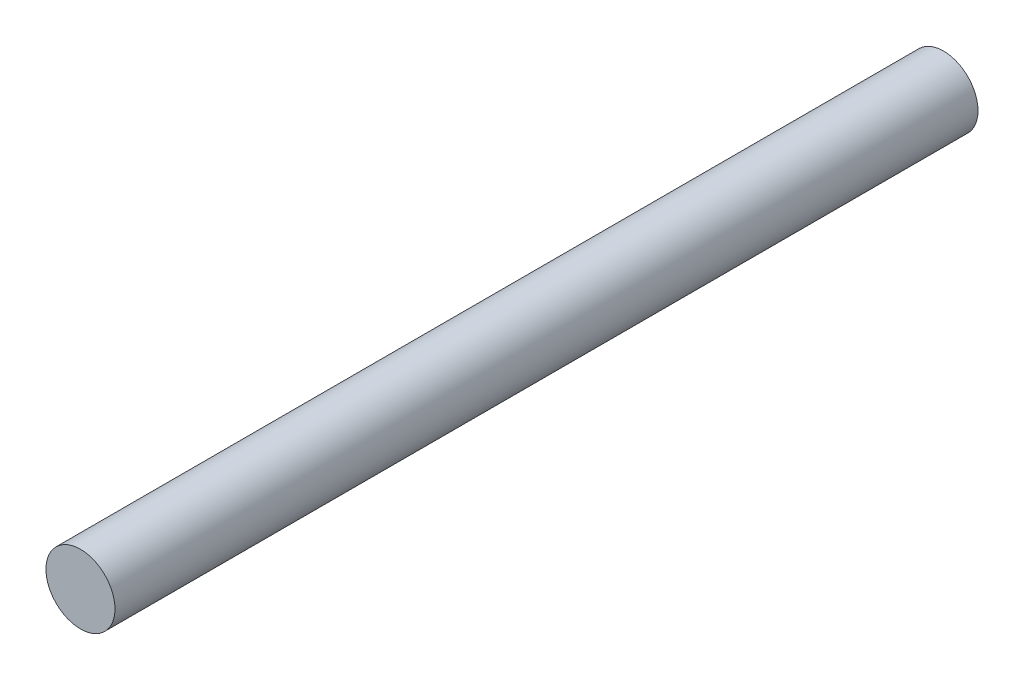
ISO-10303-21;
HEADER;
FILE_DESCRIPTION(('STEP AP214'),'2;1');
FILE_NAME('part.step','',(''),(''),'','','');
FILE_SCHEMA(('AUTOMOTIVE_DESIGN { 1 0 10303 214 1 1 1 1 }'));
ENDSEC;
DATA;
#1=APPLICATION_CONTEXT('core data for automotive mechanical design processes');
#2=APPLICATION_PROTOCOL_DEFINITION('international standard','automotive_design',2000,#1);
#3=PRODUCT_CONTEXT('',#1,'mechanical');
#4=PRODUCT('Part','Part','',(#3));
#5=PRODUCT_RELATED_PRODUCT_CATEGORY('part','',(#4));
#6=PRODUCT_DEFINITION_FORMATION('','',#4);
#7=PRODUCT_DEFINITION_CONTEXT('part definition',#1,'design');
#8=PRODUCT_DEFINITION('design','',#6,#7);
#9=PRODUCT_DEFINITION_SHAPE('','',#8);
#10=(LENGTH_UNIT() NAMED_UNIT(*) SI_UNIT(.MILLI.,.METRE.));
#11=(NAMED_UNIT(*) PLANE_ANGLE_UNIT() SI_UNIT($,.RADIAN.));
#12=(NAMED_UNIT(*) SI_UNIT($,.STERADIAN.) SOLID_ANGLE_UNIT());
#13=UNCERTAINTY_MEASURE_WITH_UNIT(LENGTH_MEASURE(1.E-05),#10,'distance_accuracy_value','');
#14=(GEOMETRIC_REPRESENTATION_CONTEXT(3) GLOBAL_UNCERTAINTY_ASSIGNED_CONTEXT((#13)) GLOBAL_UNIT_ASSIGNED_CONTEXT((#10,
#11,#12)) REPRESENTATION_CONTEXT('',''));
#15=CARTESIAN_POINT('',(0.,0.,0.));
#16=DIRECTION('',(0.,0.,1.));
#17=DIRECTION('',(1.,0.,0.));
#18=AXIS2_PLACEMENT_3D('',#15,#16,#17);
#19=CARTESIAN_POINT('',(0.,0.,75.));
#20=DIRECTION('',(0.,0.,-1.));
#21=DIRECTION('',(-1.,0.,0.));
#22=AXIS2_PLACEMENT_3D('',#19,#20,#21);
#23=CYLINDRICAL_SURFACE('',#22,3.);
#24=CARTESIAN_POINT('',(0.,0.,75.));
#25=DIRECTION('',(0.,0.,1.));
#26=DIRECTION('',(1.,0.,0.));
#27=AXIS2_PLACEMENT_3D('',#24,#25,#26);
#28=CIRCLE('',#27,3.);
#29=CARTESIAN_POINT('',(3.,0.,75.));
#30=VERTEX_POINT('',#29);
#31=EDGE_CURVE('E10',#30,#30,#28,.T.);
#32=ORIENTED_EDGE('',*,*,#31,.F.);
#33=EDGE_LOOP('',(#32));
#34=FACE_BOUND('',#33,.T.);
#35=CARTESIAN_POINT('',(0.,0.,0.));
#36=DIRECTION('',(0.,0.,1.));
#37=DIRECTION('',(1.,0.,0.));
#38=AXIS2_PLACEMENT_3D('',#35,#36,#37);
#39=CIRCLE('',#38,3.);
#40=CARTESIAN_POINT('',(3.,0.,0.));
#41=VERTEX_POINT('',#40);
#42=EDGE_CURVE('E42',#41,#41,#39,.T.);
#43=ORIENTED_EDGE('',*,*,#42,.T.);
#44=EDGE_LOOP('',(#43));
#45=FACE_BOUND('',#44,.T.);
#46=ADVANCED_FACE('F39',(#34,#45),#23,.T.);
#47=CARTESIAN_POINT('',(0.,0.,75.));
#48=DIRECTION('',(0.,0.,1.));
#49=DIRECTION('',(1.,0.,0.));
#50=AXIS2_PLACEMENT_3D('',#47,#48,#49);
#51=PLANE('',#50);
#52=ORIENTED_EDGE('',*,*,#31,.T.);
#53=EDGE_LOOP('',(#52));
#54=FACE_BOUND('',#53,.T.);
#55=ADVANCED_FACE('F54',(#54),#51,.T.);
#56=CARTESIAN_POINT('',(0.,0.,0.));
#57=DIRECTION('',(0.,0.,1.));
#58=DIRECTION('',(1.,0.,0.));
#59=AXIS2_PLACEMENT_3D('',#56,#57,#58);
#60=PLANE('',#59);
#61=ORIENTED_EDGE('',*,*,#42,.F.);
#62=EDGE_LOOP('',(#61));
#63=FACE_BOUND('',#62,.T.);
#64=ADVANCED_FACE('F52',(#63),#60,.F.);
#65=CLOSED_SHELL('',(#46,#55,#64));
#66=MANIFOLD_SOLID_BREP('B2',#65);
#67=ADVANCED_BREP_SHAPE_REPRESENTATION('',(#18,#66),#14);
#68=SHAPE_DEFINITION_REPRESENTATION(#9,#67);
ENDSEC;
END-ISO-10303-21;
